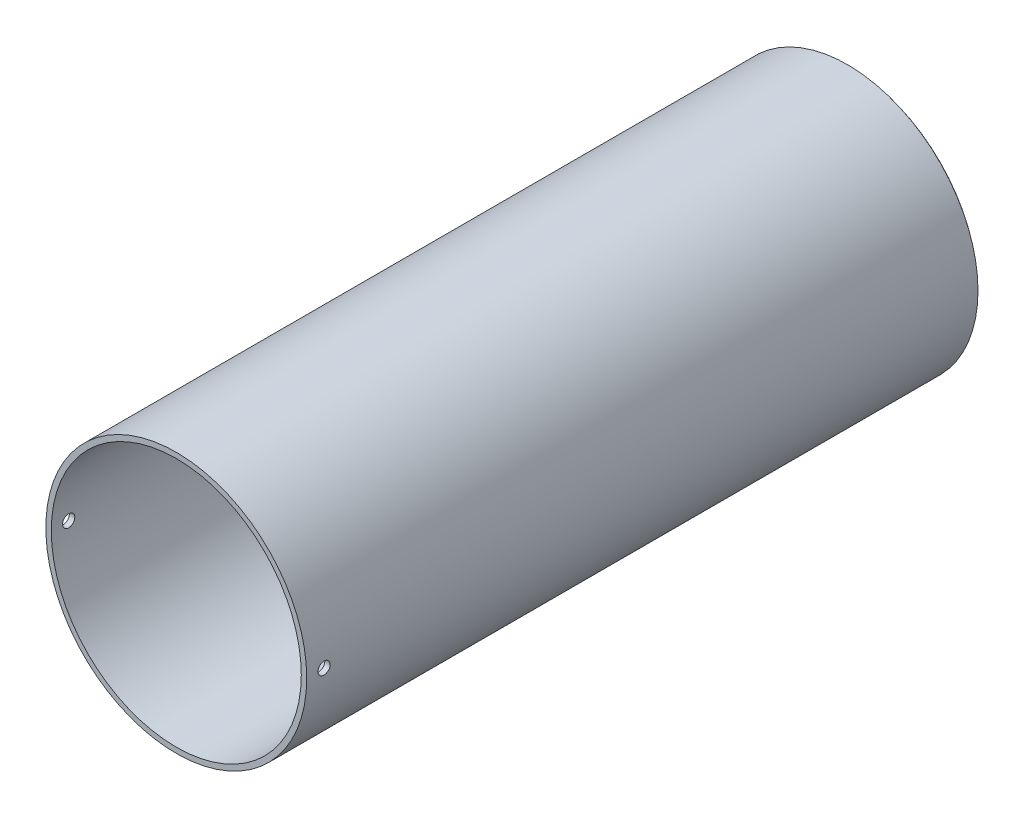
ISO-10303-21;
HEADER;
FILE_DESCRIPTION(('STEP AP214'),'2;1');
FILE_NAME('part.step','',(''),(''),'','','');
FILE_SCHEMA(('AUTOMOTIVE_DESIGN { 1 0 10303 214 1 1 1 1 }'));
ENDSEC;
DATA;
#1=APPLICATION_CONTEXT('core data for automotive mechanical design processes');
#2=APPLICATION_PROTOCOL_DEFINITION('international standard','automotive_design',2000,#1);
#3=PRODUCT_CONTEXT('',#1,'mechanical');
#4=PRODUCT('Part','Part','',(#3));
#5=PRODUCT_RELATED_PRODUCT_CATEGORY('part','',(#4));
#6=PRODUCT_DEFINITION_FORMATION('','',#4);
#7=PRODUCT_DEFINITION_CONTEXT('part definition',#1,'design');
#8=PRODUCT_DEFINITION('design','',#6,#7);
#9=PRODUCT_DEFINITION_SHAPE('','',#8);
#10=(LENGTH_UNIT() NAMED_UNIT(*) SI_UNIT(.MILLI.,.METRE.));
#11=(NAMED_UNIT(*) PLANE_ANGLE_UNIT() SI_UNIT($,.RADIAN.));
#12=(NAMED_UNIT(*) SI_UNIT($,.STERADIAN.) SOLID_ANGLE_UNIT());
#13=UNCERTAINTY_MEASURE_WITH_UNIT(LENGTH_MEASURE(1.E-05),#10,'distance_accuracy_value','');
#14=(GEOMETRIC_REPRESENTATION_CONTEXT(3) GLOBAL_UNCERTAINTY_ASSIGNED_CONTEXT((#13)) GLOBAL_UNIT_ASSIGNED_CONTEXT((#10,
#11,#12)) REPRESENTATION_CONTEXT('',''));
#15=CARTESIAN_POINT('',(0.,0.,0.));
#16=DIRECTION('',(0.,0.,1.));
#17=DIRECTION('',(1.,0.,0.));
#18=AXIS2_PLACEMENT_3D('',#15,#16,#17);
#19=CARTESIAN_POINT('',(0.,38.1,0.));
#20=DIRECTION('',(0.,0.,-1.));
#21=DIRECTION('',(-1.,0.,0.));
#22=AXIS2_PLACEMENT_3D('',#19,#20,#21);
#23=PLANE('',#22);
#24=CARTESIAN_POINT('',(0.,0.,0.));
#25=DIRECTION('',(0.,0.,1.));
#26=DIRECTION('',(1.,0.,0.));
#27=AXIS2_PLACEMENT_3D('',#24,#25,#26);
#28=CIRCLE('',#27,36.5125);
#29=CARTESIAN_POINT('',(36.5125,0.,0.));
#30=VERTEX_POINT('',#29);
#31=EDGE_CURVE('E45',#30,#30,#28,.T.);
#32=ORIENTED_EDGE('',*,*,#31,.F.);
#33=EDGE_LOOP('',(#32));
#34=FACE_BOUND('',#33,.T.);
#35=CARTESIAN_POINT('',(0.,0.,0.));
#36=DIRECTION('',(0.,0.,1.));
#37=DIRECTION('',(1.,0.,0.));
#38=AXIS2_PLACEMENT_3D('',#35,#36,#37);
#39=CIRCLE('',#38,38.1);
#40=CARTESIAN_POINT('',(38.1,0.,0.));
#41=VERTEX_POINT('',#40);
#42=EDGE_CURVE('E100',#41,#41,#39,.T.);
#43=ORIENTED_EDGE('',*,*,#42,.T.);
#44=EDGE_LOOP('',(#43));
#45=FACE_BOUND('',#44,.T.);
#46=ADVANCED_FACE('F31',(#34,#45),#23,.F.);
#47=CARTESIAN_POINT('',(0.,0.,6.98372297637004));
#48=DIRECTION('',(0.,0.,1.));
#49=DIRECTION('',(1.,0.,0.));
#50=AXIS2_PLACEMENT_3D('',#47,#48,#49);
#51=CYLINDRICAL_SURFACE('',#50,36.5125);
#52=CARTESIAN_POINT('',(36.5125,0.,-6.858));
#53=CARTESIAN_POINT('',(36.5124994204929,0.0998075755275417,-6.85799559403198));
#54=CARTESIAN_POINT('',(36.5120863777603,0.199686013452534,-6.84956776647531));
#55=CARTESIAN_POINT('',(36.5104783765829,0.396687833447208,-6.81606687988536));
#56=CARTESIAN_POINT('',(36.5092824958608,0.493807824745866,-6.79097418713155));
#57=CARTESIAN_POINT('',(36.506244178507,0.682410465229197,-6.7248634938864));
#58=CARTESIAN_POINT('',(36.5044020703647,0.773895950815854,-6.68385358328985));
#59=CARTESIAN_POINT('',(36.5002787898017,0.948659563592985,-6.58708494061618));
#60=CARTESIAN_POINT('',(36.497997721346,1.03193962713812,-6.53132969970947));
#61=CARTESIAN_POINT('',(36.4932506831572,1.18803365536662,-6.4065930189992));
#62=CARTESIAN_POINT('',(36.4907845590484,1.26083873062129,-6.33760046006383));
#63=CARTESIAN_POINT('',(36.4859466895062,1.39384040052298,-6.18836968148468));
#64=CARTESIAN_POINT('',(36.4835749479234,1.45403648117398,-6.10813100362391));
#65=CARTESIAN_POINT('',(36.4791922156014,1.56013551995046,-5.9386395573583));
#66=CARTESIAN_POINT('',(36.4771813987075,1.60603159803587,-5.84938247726926));
#67=CARTESIAN_POINT('',(36.473749133263,1.68218365209225,-5.66441827203873));
#68=CARTESIAN_POINT('',(36.4723276804101,1.71243974223388,-5.56871119398747));
#69=CARTESIAN_POINT('',(36.4702358211629,1.75642964287562,-5.37364498799));
#70=CARTESIAN_POINT('',(36.4695648142589,1.77017666464684,-5.27428884589549));
#71=CARTESIAN_POINT('',(36.4690477111512,1.78079895968665,-5.07467706476363));
#72=CARTESIAN_POINT('',(36.4692016086968,1.77767436080051,-4.97442143254795));
#73=CARTESIAN_POINT('',(36.4703164014895,1.75465312215111,-4.77594634188846));
#74=CARTESIAN_POINT('',(36.4712766099675,1.73477075563309,-4.67772522349111));
#75=CARTESIAN_POINT('',(36.4738947165247,1.67882048568433,-4.48601635762261));
#76=CARTESIAN_POINT('',(36.4755526174389,1.64275251648623,-4.39252862938649));
#77=CARTESIAN_POINT('',(36.4793800380391,1.55543857017745,-4.21289433004261));
#78=CARTESIAN_POINT('',(36.4815497770896,1.50418608284578,-4.12675092818847));
#79=CARTESIAN_POINT('',(36.4861560956191,1.38796271751476,-3.96428524501922));
#80=CARTESIAN_POINT('',(36.488592676879,1.32299174796311,-3.8879630292527));
#81=CARTESIAN_POINT('',(36.4934611022246,1.18109514436053,-3.74722314666209));
#82=CARTESIAN_POINT('',(36.4958929387495,1.10415714919051,-3.68281794162951));
#83=CARTESIAN_POINT('',(36.5004753379291,0.940553935629254,-3.5678363278642));
#84=CARTESIAN_POINT('',(36.502625900517,0.853888714923909,-3.51725992242135));
#85=CARTESIAN_POINT('',(36.5064034644708,0.673283895429682,-3.43137279584515));
#86=CARTESIAN_POINT('',(36.5080304510401,0.579344091146639,-3.39606250613828));
#87=CARTESIAN_POINT('',(36.5105772786519,0.386859934209003,-3.34171807053585));
#88=CARTESIAN_POINT('',(36.511497124717,0.288315614264195,-3.32268380903637));
#89=CARTESIAN_POINT('',(36.5125253560472,0.0895279302591268,-3.30144709464865));
#90=CARTESIAN_POINT('',(36.5126345723292,-0.0107135881936944,-3.29922740426001));
#91=CARTESIAN_POINT('',(36.5120314410053,-0.210145283020526,-3.31163786189199));
#92=CARTESIAN_POINT('',(36.5113190959743,-0.309335462688528,-3.32626795710411));
#93=CARTESIAN_POINT('',(36.509153614194,-0.503800553244399,-3.37194842433014));
#94=CARTESIAN_POINT('',(36.5077008323773,-0.599077316426904,-3.4029909292269));
#95=CARTESIAN_POINT('',(36.5042180518423,-0.783068061777955,-3.48060705735831));
#96=CARTESIAN_POINT('',(36.502188049974,-0.871782008128488,-3.52718076535027));
#97=CARTESIAN_POINT('',(36.4977771496633,-1.04020802168268,-3.63458139676938));
#98=CARTESIAN_POINT('',(36.4953959672437,-1.11991271066806,-3.69541987890972));
#99=CARTESIAN_POINT('',(36.4905518354668,-1.26798350707942,-3.82960618321753));
#100=CARTESIAN_POINT('',(36.4880888856105,-1.33634954529901,-3.90295408173173));
#101=CARTESIAN_POINT('',(36.4833564549908,-1.45986037637145,-4.06015127336657));
#102=CARTESIAN_POINT('',(36.4810871384208,-1.51499401907747,-4.14400933283956));
#103=CARTESIAN_POINT('',(36.477000450693,-1.61039881235245,-4.31980210180358));
#104=CARTESIAN_POINT('',(36.4751830776439,-1.65067002511362,-4.41173677749581));
#105=CARTESIAN_POINT('',(36.4722063827934,-1.71518735463855,-4.60103172834416));
#106=CARTESIAN_POINT('',(36.4710467687892,-1.7394405880138,-4.69838957317012));
#107=CARTESIAN_POINT('',(36.4695155338177,-1.77125677797921,-4.89580126782727));
#108=CARTESIAN_POINT('',(36.4691439086818,-1.77881982286148,-4.99585510339367));
#109=CARTESIAN_POINT('',(36.4692306632446,-1.77704010211917,-5.19570760386916));
#110=CARTESIAN_POINT('',(36.4696881816646,-1.76771487930907,-5.29550642585065));
#111=CARTESIAN_POINT('',(36.4713798372658,-1.73245958365936,-5.49211983936117));
#112=CARTESIAN_POINT('',(36.4726139759328,-1.70652947905125,-5.58893442518039));
#113=CARTESIAN_POINT('',(36.4757195814599,-1.63880401691813,-5.77683495606477));
#114=CARTESIAN_POINT('',(36.4775910536568,-1.59700852654043,-5.86792085315189));
#115=CARTESIAN_POINT('',(36.481760332638,-1.49874183620761,-6.04178360519469));
#116=CARTESIAN_POINT('',(36.4840581261533,-1.44227109298709,-6.12456071863165));
#117=CARTESIAN_POINT('',(36.4888237755972,-1.31619441083974,-6.27954357344373));
#118=CARTESIAN_POINT('',(36.4912917875911,-1.24657631330445,-6.35173941866589));
#119=CARTESIAN_POINT('',(36.4961186427336,-1.09618779551085,-6.48344138462054));
#120=CARTESIAN_POINT('',(36.4984774588621,-1.01541463446817,-6.54294437756521));
#121=CARTESIAN_POINT('',(36.5028216786487,-0.844948027233088,-6.64759794745926));
#122=CARTESIAN_POINT('',(36.5048067318859,-0.75524632933143,-6.69273508280503));
#123=CARTESIAN_POINT('',(36.5081744378893,-0.569595468228547,-6.76725434915147));
#124=CARTESIAN_POINT('',(36.509557802368,-0.473653841316839,-6.79665510360328));
#125=CARTESIAN_POINT('',(36.5112000481983,-0.314262760758964,-6.83114872779784));
#126=CARTESIAN_POINT('',(36.5116853899507,-0.251845892876802,-6.84120511453168));
#127=CARTESIAN_POINT('',(36.512335549089,-0.126295475998619,-6.85463214206612));
#128=CARTESIAN_POINT('',(36.5125003667335,-0.0631619275807328,-6.85800278825964));
#129=CARTESIAN_POINT('',(36.5125,0.,-6.858));
#130=B_SPLINE_CURVE_WITH_KNOTS('',3,(#52,#53,#54,#55,#56,#57,#58,#59,#60,#61,#62,#63,#64,#65,
#66,#67,#68,#69,#70,#71,#72,#73,#74,#75,#76,#77,#78,#79,#80,#81,#82,#83,#84,#85,#86,#87,#88,#89,
#90,#91,#92,#93,#94,#95,#96,#97,#98,#99,#100,#101,#102,#103,#104,#105,#106,#107,#108,#109,#110,
#111,#112,#113,#114,#115,#116,#117,#118,#119,#120,#121,#122,#123,#124,#125,#126,#127,#128,#129),
.UNSPECIFIED.,.T.,.F.,(4,2,2,2,2,2,2,2,2,2,2,2,2,2,2,2,2,2,2,2,2,2,2,2,2,2,2,2,2,2,2,2,2,2,2,2,
2,2,4),(0.,0.299192163231982,0.598737446682097,0.898130685767931,1.19745310253284,
1.49702805479517,1.79661521662562,2.09634629452754,2.39607518438599,2.69556405804134,
2.99505066231302,3.29428243962105,3.59351543281612,3.8928769054922,4.19224037606398,
4.49191514768168,4.79158999059194,5.09127330187835,5.39095448458327,5.69032840673037,
5.98970139061961,6.2889310031247,6.58816224862056,6.88763680358161,7.18711318634338,
7.48684104082691,7.78656764107732,8.08616098636413,8.38575274677996,8.68503348249017,
8.98431479078668,9.28359860524393,9.58287310627348,9.88242574237025,10.1820521095302,
10.4819580074323,10.7815081880818,10.9708482145295,11.1601880882505),.UNSPECIFIED.);
#131=CARTESIAN_POINT('',(36.5125,0.,-6.858));
#132=VERTEX_POINT('',#131);
#133=EDGE_CURVE('E71',#132,#132,#130,.T.);
#134=ORIENTED_EDGE('',*,*,#133,.T.);
#135=EDGE_LOOP('',(#134));
#136=FACE_BOUND('',#135,.T.);
#137=CARTESIAN_POINT('',(-36.5125,0.,-6.858));
#138=CARTESIAN_POINT('',(-36.512499420493,-0.0998075755275418,-6.85799559403197));
#139=CARTESIAN_POINT('',(-36.5120863777603,-0.199686013452534,-6.84956776647531));
#140=CARTESIAN_POINT('',(-36.5104783765829,-0.396687833447208,-6.81606687988536));
#141=CARTESIAN_POINT('',(-36.5092824958608,-0.493807824745866,-6.79097418713155));
#142=CARTESIAN_POINT('',(-36.506244178507,-0.682410465229196,-6.7248634938864));
#143=CARTESIAN_POINT('',(-36.5044020703647,-0.773895950815854,-6.68385358328985));
#144=CARTESIAN_POINT('',(-36.5002787898017,-0.948659563592984,-6.58708494061618));
#145=CARTESIAN_POINT('',(-36.497997721346,-1.03193962713812,-6.53132969970947));
#146=CARTESIAN_POINT('',(-36.4932506831572,-1.18803365536662,-6.4065930189992));
#147=CARTESIAN_POINT('',(-36.4907845590484,-1.26083873062129,-6.33760046006383));
#148=CARTESIAN_POINT('',(-36.4859466895062,-1.39384040052298,-6.18836968148468));
#149=CARTESIAN_POINT('',(-36.4835749479234,-1.45403648117398,-6.10813100362391));
#150=CARTESIAN_POINT('',(-36.4791922156014,-1.56013551995046,-5.9386395573583));
#151=CARTESIAN_POINT('',(-36.4771813987075,-1.60603159803587,-5.84938247726926));
#152=CARTESIAN_POINT('',(-36.473749133263,-1.68218365209225,-5.66441827203873));
#153=CARTESIAN_POINT('',(-36.4723276804101,-1.71243974223388,-5.56871119398747));
#154=CARTESIAN_POINT('',(-36.4702358211629,-1.75642964287562,-5.37364498799));
#155=CARTESIAN_POINT('',(-36.4695648142589,-1.77017666464684,-5.27428884589549));
#156=CARTESIAN_POINT('',(-36.4690477111512,-1.78079895968665,-5.07467706476363));
#157=CARTESIAN_POINT('',(-36.4692016086968,-1.77767436080051,-4.97442143254795));
#158=CARTESIAN_POINT('',(-36.4703164014895,-1.75465312215111,-4.77594634188847));
#159=CARTESIAN_POINT('',(-36.4712766099675,-1.73477075563309,-4.67772522349111));
#160=CARTESIAN_POINT('',(-36.4738947165247,-1.67882048568433,-4.48601635762261));
#161=CARTESIAN_POINT('',(-36.4755526174389,-1.64275251648623,-4.39252862938649));
#162=CARTESIAN_POINT('',(-36.4793800380391,-1.55543857017745,-4.21289433004261));
#163=CARTESIAN_POINT('',(-36.4815497770896,-1.50418608284578,-4.12675092818847));
#164=CARTESIAN_POINT('',(-36.4861560956191,-1.38796271751476,-3.96428524501922));
#165=CARTESIAN_POINT('',(-36.488592676879,-1.32299174796311,-3.8879630292527));
#166=CARTESIAN_POINT('',(-36.4934611022246,-1.18109514436053,-3.74722314666209));
#167=CARTESIAN_POINT('',(-36.4958929387495,-1.10415714919051,-3.68281794162951));
#168=CARTESIAN_POINT('',(-36.5004753379291,-0.940553935629253,-3.5678363278642));
#169=CARTESIAN_POINT('',(-36.502625900517,-0.853888714923908,-3.51725992242135));
#170=CARTESIAN_POINT('',(-36.5064034644708,-0.673283895429682,-3.43137279584515));
#171=CARTESIAN_POINT('',(-36.5080304510401,-0.579344091146639,-3.39606250613828));
#172=CARTESIAN_POINT('',(-36.5105772786519,-0.386859934209003,-3.34171807053585));
#173=CARTESIAN_POINT('',(-36.511497124717,-0.288315614264195,-3.32268380903637));
#174=CARTESIAN_POINT('',(-36.5125253560472,-0.0895279302591271,-3.30144709464865));
#175=CARTESIAN_POINT('',(-36.5126345723292,0.010713588193694,-3.29922740426001));
#176=CARTESIAN_POINT('',(-36.5120314410053,0.210145283020526,-3.31163786189199));
#177=CARTESIAN_POINT('',(-36.5113190959743,0.309335462688528,-3.32626795710411));
#178=CARTESIAN_POINT('',(-36.509153614194,0.503800553244398,-3.37194842433014));
#179=CARTESIAN_POINT('',(-36.5077008323773,0.599077316426903,-3.4029909292269));
#180=CARTESIAN_POINT('',(-36.5042180518423,0.783068061777954,-3.48060705735831));
#181=CARTESIAN_POINT('',(-36.502188049974,0.871782008128487,-3.52718076535027));
#182=CARTESIAN_POINT('',(-36.4977771496633,1.04020802168268,-3.63458139676938));
#183=CARTESIAN_POINT('',(-36.4953959672437,1.11991271066805,-3.69541987890972));
#184=CARTESIAN_POINT('',(-36.4905518354668,1.26798350707942,-3.82960618321753));
#185=CARTESIAN_POINT('',(-36.4880888856105,1.33634954529901,-3.90295408173173));
#186=CARTESIAN_POINT('',(-36.4833564549908,1.45986037637145,-4.06015127336656));
#187=CARTESIAN_POINT('',(-36.4810871384208,1.51499401907747,-4.14400933283956));
#188=CARTESIAN_POINT('',(-36.477000450693,1.61039881235245,-4.31980210180358));
#189=CARTESIAN_POINT('',(-36.4751830776439,1.65067002511362,-4.41173677749581));
#190=CARTESIAN_POINT('',(-36.4722063827934,1.71518735463855,-4.60103172834416));
#191=CARTESIAN_POINT('',(-36.4710467687892,1.7394405880138,-4.69838957317011));
#192=CARTESIAN_POINT('',(-36.4695155338177,1.77125677797921,-4.89580126782726));
#193=CARTESIAN_POINT('',(-36.4691439086818,1.77881982286148,-4.99585510339367));
#194=CARTESIAN_POINT('',(-36.4692306632446,1.77704010211917,-5.19570760386916));
#195=CARTESIAN_POINT('',(-36.4696881816646,1.76771487930907,-5.29550642585064));
#196=CARTESIAN_POINT('',(-36.4713798372658,1.73245958365936,-5.49211983936117));
#197=CARTESIAN_POINT('',(-36.4726139759328,1.70652947905125,-5.58893442518039));
#198=CARTESIAN_POINT('',(-36.4757195814599,1.63880401691813,-5.77683495606477));
#199=CARTESIAN_POINT('',(-36.4775910536568,1.59700852654043,-5.86792085315189));
#200=CARTESIAN_POINT('',(-36.481760332638,1.49874183620761,-6.04178360519469));
#201=CARTESIAN_POINT('',(-36.4840581261533,1.44227109298709,-6.12456071863165));
#202=CARTESIAN_POINT('',(-36.4888237755972,1.31619441083975,-6.27954357344373));
#203=CARTESIAN_POINT('',(-36.4912917875911,1.24657631330445,-6.35173941866589));
#204=CARTESIAN_POINT('',(-36.4961186427336,1.09618779551085,-6.48344138462054));
#205=CARTESIAN_POINT('',(-36.4984774588621,1.01541463446817,-6.54294437756521));
#206=CARTESIAN_POINT('',(-36.5028216786487,0.844948027233088,-6.64759794745926));
#207=CARTESIAN_POINT('',(-36.5048067318859,0.755246329331431,-6.69273508280503));
#208=CARTESIAN_POINT('',(-36.5081744378893,0.569595468228547,-6.76725434915147));
#209=CARTESIAN_POINT('',(-36.509557802368,0.473653841316839,-6.79665510360328));
#210=CARTESIAN_POINT('',(-36.5112000481983,0.314262760758965,-6.83114872779784));
#211=CARTESIAN_POINT('',(-36.5116853899507,0.251845892876802,-6.84120511453168));
#212=CARTESIAN_POINT('',(-36.512335549089,0.126295475998619,-6.85463214206612));
#213=CARTESIAN_POINT('',(-36.5125003667335,0.0631619275807331,-6.85800278825963));
#214=CARTESIAN_POINT('',(-36.5125,0.,-6.858));
#215=B_SPLINE_CURVE_WITH_KNOTS('',3,(#137,#138,#139,#140,#141,#142,#143,#144,#145,#146,#147,
#148,#149,#150,#151,#152,#153,#154,#155,#156,#157,#158,#159,#160,#161,#162,#163,#164,#165,#166,
#167,#168,#169,#170,#171,#172,#173,#174,#175,#176,#177,#178,#179,#180,#181,#182,#183,#184,#185,
#186,#187,#188,#189,#190,#191,#192,#193,#194,#195,#196,#197,#198,#199,#200,#201,#202,#203,#204,
#205,#206,#207,#208,#209,#210,#211,#212,#213,#214),.UNSPECIFIED.,.T.,.F.,(4,2,2,2,2,2,2,2,2,2,2,
2,2,2,2,2,2,2,2,2,2,2,2,2,2,2,2,2,2,2,2,2,2,2,2,2,2,2,4),(0.,0.299192163231982,
0.598737446682097,0.89813068576793,1.19745310253284,1.49702805479517,1.79661521662562,
2.09634629452754,2.39607518438599,2.69556405804134,2.99505066231302,3.29428243962105,
3.59351543281611,3.8928769054922,4.19224037606398,4.49191514768168,4.79158999059194,
5.09127330187835,5.39095448458327,5.69032840673037,5.98970139061961,6.2889310031247,
6.58816224862056,6.88763680358161,7.18711318634337,7.48684104082691,7.78656764107732,
8.08616098636413,8.38575274677996,8.68503348249017,8.98431479078667,9.28359860524393,
9.58287310627348,9.88242574237025,10.1820521095302,10.4819580074323,10.7815081880819,
10.9708482145295,11.1601880882505),.UNSPECIFIED.);
#216=CARTESIAN_POINT('',(-36.5125,0.,-6.858));
#217=VERTEX_POINT('',#216);
#218=EDGE_CURVE('E67',#217,#217,#215,.T.);
#219=ORIENTED_EDGE('',*,*,#218,.T.);
#220=EDGE_LOOP('',(#219));
#221=FACE_BOUND('',#220,.T.);
#222=CARTESIAN_POINT('',(0.,0.,-196.85));
#223=DIRECTION('',(0.,0.,1.));
#224=DIRECTION('',(1.,0.,0.));
#225=AXIS2_PLACEMENT_3D('',#222,#223,#224);
#226=CIRCLE('',#225,36.5125);
#227=CARTESIAN_POINT('',(36.5125,0.,-196.85));
#228=VERTEX_POINT('',#227);
#229=EDGE_CURVE('E49',#228,#228,#226,.T.);
#230=ORIENTED_EDGE('',*,*,#229,.F.);
#231=EDGE_LOOP('',(#230));
#232=FACE_BOUND('',#231,.T.);
#233=ORIENTED_EDGE('',*,*,#31,.T.);
#234=EDGE_LOOP('',(#233));
#235=FACE_BOUND('',#234,.T.);
#236=ADVANCED_FACE('F75',(#136,#221,#232,#235),#51,.F.);
#237=CARTESIAN_POINT('',(0.,36.5125,-196.85));
#238=DIRECTION('',(0.,0.,1.));
#239=DIRECTION('',(1.,0.,0.));
#240=AXIS2_PLACEMENT_3D('',#237,#238,#239);
#241=PLANE('',#240);
#242=CARTESIAN_POINT('',(0.,0.,-196.85));
#243=DIRECTION('',(0.,0.,1.));
#244=DIRECTION('',(1.,0.,0.));
#245=AXIS2_PLACEMENT_3D('',#242,#243,#244);
#246=CIRCLE('',#245,37.084);
#247=CARTESIAN_POINT('',(37.084,0.,-196.85));
#248=VERTEX_POINT('',#247);
#249=EDGE_CURVE('E104',#248,#248,#246,.T.);
#250=ORIENTED_EDGE('',*,*,#249,.F.);
#251=EDGE_LOOP('',(#250));
#252=FACE_BOUND('',#251,.T.);
#253=ORIENTED_EDGE('',*,*,#229,.T.);
#254=EDGE_LOOP('',(#253));
#255=FACE_BOUND('',#254,.T.);
#256=ADVANCED_FACE('F79',(#252,#255),#241,.F.);
#257=CARTESIAN_POINT('',(0.,0.,-196.85));
#258=DIRECTION('',(0.,0.,1.));
#259=DIRECTION('',(1.,0.,0.));
#260=AXIS2_PLACEMENT_3D('',#257,#258,#259);
#261=CONICAL_SURFACE('',#260,37.084,0.916297857297025);
#262=CARTESIAN_POINT('',(0.,0.,-196.070395780213));
#263=DIRECTION('',(0.,0.,1.));
#264=DIRECTION('',(1.,0.,0.));
#265=AXIS2_PLACEMENT_3D('',#262,#263,#264);
#266=CIRCLE('',#265,38.1);
#267=CARTESIAN_POINT('',(38.1,0.,-196.070395780213));
#268=VERTEX_POINT('',#267);
#269=EDGE_CURVE('E102',#268,#268,#266,.T.);
#270=ORIENTED_EDGE('',*,*,#269,.F.);
#271=EDGE_LOOP('',(#270));
#272=FACE_BOUND('',#271,.T.);
#273=ORIENTED_EDGE('',*,*,#249,.T.);
#274=EDGE_LOOP('',(#273));
#275=FACE_BOUND('',#274,.T.);
#276=ADVANCED_FACE('F83',(#272,#275),#261,.T.);
#277=CARTESIAN_POINT('',(0.,0.,6.98372297637004));
#278=DIRECTION('',(0.,0.,1.));
#279=DIRECTION('',(1.,0.,0.));
#280=AXIS2_PLACEMENT_3D('',#277,#278,#279);
#281=CYLINDRICAL_SURFACE('',#280,38.1);
#282=CARTESIAN_POINT('',(-38.1,0.,-6.858));
#283=CARTESIAN_POINT('',(-38.0999994441626,0.099812749705971,-6.8579955920693));
#284=CARTESIAN_POINT('',(-38.0996035700821,0.199696488633295,-6.84956689417117));
#285=CARTESIAN_POINT('',(-38.0980624074167,0.396709119321493,-6.81606234890933));
#286=CARTESIAN_POINT('',(-38.0969162334145,0.493834614653942,-6.79096683278246));
#287=CARTESIAN_POINT('',(-38.0940042133738,0.682448290159791,-6.72484820008546));
#288=CARTESIAN_POINT('',(-38.0922386806371,0.773939293077813,-6.68383313528286));
#289=CARTESIAN_POINT('',(-38.0882868464822,0.948712850242141,-6.58705188233875));
#290=CARTESIAN_POINT('',(-38.0861006451061,1.03199734902628,-6.53128920024976));
#291=CARTESIAN_POINT('',(-38.0815512575883,1.18809356149998,-6.40653951193624));
#292=CARTESIAN_POINT('',(-38.0791879341195,1.26089701854364,-6.33754217857001));
#293=CARTESIAN_POINT('',(-38.0745518511581,1.39389425938046,-6.1883021254132));
#294=CARTESIAN_POINT('',(-38.0722790953491,1.45408753071392,-6.10805894882889));
#295=CARTESIAN_POINT('',(-38.0680794957026,1.56017749349482,-5.93856299677354));
#296=CARTESIAN_POINT('',(-38.0661528043202,1.60606789047024,-5.84930627739617));
#297=CARTESIAN_POINT('',(-38.0628642325493,1.68220901568922,-5.66434470731891));
#298=CARTESIAN_POINT('',(-38.0615023482826,1.71245985131671,-5.5686399008978));
#299=CARTESIAN_POINT('',(-38.0594981818559,1.75644174475752,-5.37357344734878));
#300=CARTESIAN_POINT('',(-38.0588553712412,1.77018493476086,-5.27421454119815));
#301=CARTESIAN_POINT('',(-38.0583602519083,1.7807988437729,-5.07459807647242));
#302=CARTESIAN_POINT('',(-38.0585079375731,1.77766968266979,-4.97434052428779));
#303=CARTESIAN_POINT('',(-38.0595766652147,1.75463783614635,-4.77585513404908));
#304=CARTESIAN_POINT('',(-38.0604971029412,1.73474825642347,-4.67762577153215));
#305=CARTESIAN_POINT('',(-38.0630066370585,1.67878046915408,-4.48590162991956));
#306=CARTESIAN_POINT('',(-38.0645957360032,1.6427021997794,-4.39240686890791));
#307=CARTESIAN_POINT('',(-38.0682641777502,1.55536617746858,-4.21276366904884));
#308=CARTESIAN_POINT('',(-38.0703437136753,1.50410244280331,-4.12661814240488));
#309=CARTESIAN_POINT('',(-38.0747584393152,1.38785504655009,-3.96415062842462));
#310=CARTESIAN_POINT('',(-38.0770936305887,1.3228713013111,-3.88782870098748));
#311=CARTESIAN_POINT('',(-38.0817591452121,1.18095454234457,-3.74709859637983));
#312=CARTESIAN_POINT('',(-38.0840894617842,1.10401017741824,-3.68270186534097));
#313=CARTESIAN_POINT('',(-38.088480419358,0.940396266369328,-3.56773832386292));
#314=CARTESIAN_POINT('',(-38.0905410602989,0.853726718046912,-3.51717151655206));
#315=CARTESIAN_POINT('',(-38.0941604958614,0.673116036890435,-3.43130435903327));
#316=CARTESIAN_POINT('',(-38.0957192776119,0.579174717632103,-3.39600440037001));
#317=CARTESIAN_POINT('',(-38.0981591193834,0.386690089224036,-3.34168042202306));
#318=CARTESIAN_POINT('',(-38.0990401838275,0.288146810112509,-3.32265629611836));
#319=CARTESIAN_POINT('',(-38.1000247215275,0.0893549286928191,-3.30143809909175));
#320=CARTESIAN_POINT('',(-38.1001289263276,-0.0108919801592819,-3.29922819451116));
#321=CARTESIAN_POINT('',(-38.0995499416424,-0.21033283378834,-3.31165986280598));
#322=CARTESIAN_POINT('',(-38.0988667544199,-0.30952678159049,-3.32630138725342));
#323=CARTESIAN_POINT('',(-38.0967904151398,-0.504001641924741,-3.37200719005056));
#324=CARTESIAN_POINT('',(-38.0953975752808,-0.599284255275615,-3.40306424691214));
#325=CARTESIAN_POINT('',(-38.0920587727529,-0.783284086181714,-3.48071219826117));
#326=CARTESIAN_POINT('',(-38.0901128073146,-0.872001270861628,-3.52730317052572));
#327=CARTESIAN_POINT('',(-38.0858849031983,-1.04042463048986,-3.63473699361767));
#328=CARTESIAN_POINT('',(-38.0836027145791,-1.12012402319646,-3.6955904669461));
#329=CARTESIAN_POINT('',(-38.0789602539419,-1.26818124891685,-3.82980635094148));
#330=CARTESIAN_POINT('',(-38.076599981484,-1.3365390180238,-3.90316883208845));
#331=CARTESIAN_POINT('',(-38.0720653073109,-1.46002579536328,-4.06038830494075));
#332=CARTESIAN_POINT('',(-38.0698910502801,-1.51514456533936,-4.1442533429394));
#333=CARTESIAN_POINT('',(-38.0659758510027,-1.61051875653525,-4.32005659154494));
#334=CARTESIAN_POINT('',(-38.0642349070522,-1.65077423620081,-4.4119947704047));
#335=CARTESIAN_POINT('',(-38.0613836782557,-1.71526126543727,-4.601296459495));
#336=CARTESIAN_POINT('',(-38.0602731357968,-1.7394993611645,-4.69865773569407));
#337=CARTESIAN_POINT('',(-38.0588072127904,-1.77128501007475,-4.89607321450444));
#338=CARTESIAN_POINT('',(-38.0584518286875,-1.77883264184133,-4.99612740443446));
#339=CARTESIAN_POINT('',(-38.0585363887879,-1.77702234695512,-5.19598657332258));
#340=CARTESIAN_POINT('',(-38.058975575064,-1.7676805308663,-5.29579169893085));
#341=CARTESIAN_POINT('',(-38.0605981738535,-1.73238979649967,-5.49241503733707));
#342=CARTESIAN_POINT('',(-38.0617815877987,-1.70644084627188,-5.5892332443882));
#343=CARTESIAN_POINT('',(-38.0647590917723,-1.63867561828834,-5.77713810744827));
#344=CARTESIAN_POINT('',(-38.0665531878077,-1.59685918445162,-5.86822470706781));
#345=CARTESIAN_POINT('',(-38.0705497783215,-1.49854901841658,-6.04208499627897));
#346=CARTESIAN_POINT('',(-38.0727522598193,-1.4420557527016,-6.12485894996094));
#347=CARTESIAN_POINT('',(-38.0773197466704,-1.31593869804536,-6.27982423873161));
#348=CARTESIAN_POINT('',(-38.0796848877922,-1.24630385345847,-6.35200657183645));
#349=CARTESIAN_POINT('',(-38.0843102455238,-1.09588429578184,-6.48367851303091));
#350=CARTESIAN_POINT('',(-38.0865704361442,-1.01509684039659,-6.54316499017175));
#351=CARTESIAN_POINT('',(-38.0907325911875,-0.84460837262856,-6.64778082532395));
#352=CARTESIAN_POINT('',(-38.0926342331504,-0.754899446428707,-6.69289728458513));
#353=CARTESIAN_POINT('',(-38.0958600297057,-0.569238781007752,-6.76737452153843));
#354=CARTESIAN_POINT('',(-38.097184867368,-0.473294581463816,-6.7967539450766));
#355=CARTESIAN_POINT('',(-38.0987566163946,-0.313960199942343,-6.83120079287984));
#356=CARTESIAN_POINT('',(-38.0992208413613,-0.251602509841593,-6.84123770260242));
#357=CARTESIAN_POINT('',(-38.0998427087481,-0.126172670062449,-6.8546386970259));
#358=CARTESIAN_POINT('',(-38.1000003513943,-0.0631005209107072,-6.85800278664524));
#359=CARTESIAN_POINT('',(-38.1,0.,-6.858));
#360=B_SPLINE_CURVE_WITH_KNOTS('',3,(#282,#283,#284,#285,#286,#287,#288,#289,#290,#291,#292,
#293,#294,#295,#296,#297,#298,#299,#300,#301,#302,#303,#304,#305,#306,#307,#308,#309,#310,#311,
#312,#313,#314,#315,#316,#317,#318,#319,#320,#321,#322,#323,#324,#325,#326,#327,#328,#329,#330,
#331,#332,#333,#334,#335,#336,#337,#338,#339,#340,#341,#342,#343,#344,#345,#346,#347,#348,#349,
#350,#351,#352,#353,#354,#355,#356,#357,#358,#359),.UNSPECIFIED.,.T.,.F.,(4,2,2,2,2,2,2,2,2,2,2,
2,2,2,2,2,2,2,2,2,2,2,2,2,2,2,2,2,2,2,2,2,2,2,2,2,2,2,4),(0.,0.299207911802189,
0.598769552290252,0.89817987792177,1.19751908656271,1.49709283009209,1.79667874550469,
2.09639631845101,2.39611183345751,2.69560693939394,2.99509991724043,3.29435892562804,
3.59361907696143,3.8929972674183,4.19237728323954,4.49204317948553,4.79170914351585,
5.09138279254103,5.39105448579052,5.69044395203593,5.98983255789223,6.28908956679763,
6.58834807408228,6.88783017697323,7.18731396730423,7.48702862026928,7.78674209467751,
8.08633300308866,8.3859225009357,8.68522637609414,8.98453082707588,9.28383822225079,
9.58313610550644,9.88268691134155,10.1823115048188,10.4822042929338,10.7817409661158,
10.9708970515584,11.1600529975768),.UNSPECIFIED.);
#361=CARTESIAN_POINT('',(-38.1,0.,-6.858));
#362=VERTEX_POINT('',#361);
#363=EDGE_CURVE('E10',#362,#362,#360,.T.);
#364=ORIENTED_EDGE('',*,*,#363,.T.);
#365=EDGE_LOOP('',(#364));
#366=FACE_BOUND('',#365,.T.);
#367=CARTESIAN_POINT('',(38.1,0.,-6.858));
#368=CARTESIAN_POINT('',(38.0999994441626,-0.0998127497059708,-6.8579955920693));
#369=CARTESIAN_POINT('',(38.0996035700821,-0.199696488633295,-6.84956689417117));
#370=CARTESIAN_POINT('',(38.0980624074167,-0.396709119321493,-6.81606234890933));
#371=CARTESIAN_POINT('',(38.0969162334145,-0.493834614653942,-6.79096683278246));
#372=CARTESIAN_POINT('',(38.0940042133738,-0.682448290159792,-6.72484820008546));
#373=CARTESIAN_POINT('',(38.0922386806371,-0.773939293077814,-6.68383313528286));
#374=CARTESIAN_POINT('',(38.0882868464822,-0.948712850242142,-6.58705188233875));
#375=CARTESIAN_POINT('',(38.0861006451061,-1.03199734902628,-6.53128920024976));
#376=CARTESIAN_POINT('',(38.0815512575883,-1.18809356149998,-6.40653951193624));
#377=CARTESIAN_POINT('',(38.0791879341195,-1.26089701854364,-6.33754217857001));
#378=CARTESIAN_POINT('',(38.0745518511581,-1.39389425938046,-6.1883021254132));
#379=CARTESIAN_POINT('',(38.0722790953491,-1.45408753071392,-6.10805894882889));
#380=CARTESIAN_POINT('',(38.0680794957026,-1.56017749349482,-5.93856299677354));
#381=CARTESIAN_POINT('',(38.0661528043202,-1.60606789047024,-5.84930627739617));
#382=CARTESIAN_POINT('',(38.0628642325493,-1.68220901568922,-5.66434470731891));
#383=CARTESIAN_POINT('',(38.0615023482826,-1.71245985131671,-5.5686399008978));
#384=CARTESIAN_POINT('',(38.0594981818559,-1.75644174475752,-5.37357344734878));
#385=CARTESIAN_POINT('',(38.0588553712412,-1.77018493476086,-5.27421454119815));
#386=CARTESIAN_POINT('',(38.0583602519083,-1.7807988437729,-5.07459807647242));
#387=CARTESIAN_POINT('',(38.0585079375731,-1.77766968266979,-4.97434052428779));
#388=CARTESIAN_POINT('',(38.0595766652147,-1.75463783614635,-4.77585513404908));
#389=CARTESIAN_POINT('',(38.0604971029412,-1.73474825642347,-4.67762577153215));
#390=CARTESIAN_POINT('',(38.0630066370585,-1.67878046915408,-4.48590162991956));
#391=CARTESIAN_POINT('',(38.0645957360032,-1.6427021997794,-4.39240686890791));
#392=CARTESIAN_POINT('',(38.0682641777502,-1.55536617746858,-4.21276366904884));
#393=CARTESIAN_POINT('',(38.0703437136753,-1.50410244280331,-4.12661814240488));
#394=CARTESIAN_POINT('',(38.0747584393152,-1.38785504655009,-3.96415062842463));
#395=CARTESIAN_POINT('',(38.0770936305887,-1.3228713013111,-3.88782870098748));
#396=CARTESIAN_POINT('',(38.0817591452121,-1.18095454234457,-3.74709859637983));
#397=CARTESIAN_POINT('',(38.0840894617842,-1.10401017741824,-3.68270186534097));
#398=CARTESIAN_POINT('',(38.088480419358,-0.940396266369329,-3.56773832386292));
#399=CARTESIAN_POINT('',(38.0905410602989,-0.853726718046914,-3.51717151655206));
#400=CARTESIAN_POINT('',(38.0941604958614,-0.673116036890436,-3.43130435903327));
#401=CARTESIAN_POINT('',(38.0957192776119,-0.579174717632104,-3.39600440037002));
#402=CARTESIAN_POINT('',(38.0981591193834,-0.386690089224038,-3.34168042202306));
#403=CARTESIAN_POINT('',(38.0990401838275,-0.28814681011251,-3.32265629611837));
#404=CARTESIAN_POINT('',(38.1000247215275,-0.0893549286928202,-3.30143809909175));
#405=CARTESIAN_POINT('',(38.1001289263276,0.0108919801592808,-3.29922819451116));
#406=CARTESIAN_POINT('',(38.0995499416424,0.210332833788339,-3.31165986280598));
#407=CARTESIAN_POINT('',(38.0988667544199,0.309526781590489,-3.32630138725342));
#408=CARTESIAN_POINT('',(38.0967904151398,0.504001641924741,-3.37200719005056));
#409=CARTESIAN_POINT('',(38.0953975752808,0.599284255275614,-3.40306424691214));
#410=CARTESIAN_POINT('',(38.0920587727529,0.783284086181714,-3.48071219826117));
#411=CARTESIAN_POINT('',(38.0901128073146,0.872001270861628,-3.52730317052572));
#412=CARTESIAN_POINT('',(38.0858849031983,1.04042463048986,-3.63473699361767));
#413=CARTESIAN_POINT('',(38.0836027145791,1.12012402319646,-3.6955904669461));
#414=CARTESIAN_POINT('',(38.0789602539419,1.26818124891685,-3.82980635094148));
#415=CARTESIAN_POINT('',(38.076599981484,1.3365390180238,-3.90316883208845));
#416=CARTESIAN_POINT('',(38.0720653073109,1.46002579536328,-4.06038830494075));
#417=CARTESIAN_POINT('',(38.0698910502801,1.51514456533936,-4.1442533429394));
#418=CARTESIAN_POINT('',(38.0659758510027,1.61051875653525,-4.32005659154494));
#419=CARTESIAN_POINT('',(38.0642349070522,1.65077423620081,-4.4119947704047));
#420=CARTESIAN_POINT('',(38.0613836782557,1.71526126543727,-4.601296459495));
#421=CARTESIAN_POINT('',(38.0602731357968,1.7394993611645,-4.69865773569408));
#422=CARTESIAN_POINT('',(38.0588072127904,1.77128501007475,-4.89607321450444));
#423=CARTESIAN_POINT('',(38.0584518286875,1.77883264184133,-4.99612740443446));
#424=CARTESIAN_POINT('',(38.0585363887879,1.77702234695512,-5.19598657332258));
#425=CARTESIAN_POINT('',(38.058975575064,1.7676805308663,-5.29579169893085));
#426=CARTESIAN_POINT('',(38.0605981738535,1.73238979649967,-5.49241503733707));
#427=CARTESIAN_POINT('',(38.0617815877987,1.70644084627188,-5.5892332443882));
#428=CARTESIAN_POINT('',(38.0647590917723,1.63867561828834,-5.77713810744827));
#429=CARTESIAN_POINT('',(38.0665531878077,1.59685918445162,-5.86822470706781));
#430=CARTESIAN_POINT('',(38.0705497783215,1.49854901841658,-6.04208499627897));
#431=CARTESIAN_POINT('',(38.0727522598193,1.4420557527016,-6.12485894996094));
#432=CARTESIAN_POINT('',(38.0773197466704,1.31593869804536,-6.27982423873161));
#433=CARTESIAN_POINT('',(38.0796848877922,1.24630385345847,-6.35200657183645));
#434=CARTESIAN_POINT('',(38.0843102455238,1.09588429578184,-6.48367851303091));
#435=CARTESIAN_POINT('',(38.0865704361442,1.01509684039659,-6.54316499017174));
#436=CARTESIAN_POINT('',(38.0907325911875,0.844608372628561,-6.64778082532395));
#437=CARTESIAN_POINT('',(38.0926342331504,0.754899446428709,-6.69289728458513));
#438=CARTESIAN_POINT('',(38.0958600297057,0.569238781007753,-6.76737452153843));
#439=CARTESIAN_POINT('',(38.097184867368,0.473294581463817,-6.7967539450766));
#440=CARTESIAN_POINT('',(38.0987566163946,0.313960199942344,-6.83120079287984));
#441=CARTESIAN_POINT('',(38.0992208413613,0.251602509841592,-6.84123770260242));
#442=CARTESIAN_POINT('',(38.0998427087481,0.126172670062448,-6.8546386970259));
#443=CARTESIAN_POINT('',(38.1000003513943,0.0631005209107069,-6.85800278664524));
#444=CARTESIAN_POINT('',(38.1,0.,-6.858));
#445=B_SPLINE_CURVE_WITH_KNOTS('',3,(#367,#368,#369,#370,#371,#372,#373,#374,#375,#376,#377,
#378,#379,#380,#381,#382,#383,#384,#385,#386,#387,#388,#389,#390,#391,#392,#393,#394,#395,#396,
#397,#398,#399,#400,#401,#402,#403,#404,#405,#406,#407,#408,#409,#410,#411,#412,#413,#414,#415,
#416,#417,#418,#419,#420,#421,#422,#423,#424,#425,#426,#427,#428,#429,#430,#431,#432,#433,#434,
#435,#436,#437,#438,#439,#440,#441,#442,#443,#444),.UNSPECIFIED.,.T.,.F.,(4,2,2,2,2,2,2,2,2,2,2,
2,2,2,2,2,2,2,2,2,2,2,2,2,2,2,2,2,2,2,2,2,2,2,2,2,2,2,4),(0.,0.299207911802189,
0.598769552290253,0.89817987792177,1.19751908656271,1.49709283009209,1.79667874550469,
2.09639631845101,2.39611183345751,2.69560693939394,2.99509991724043,3.29435892562804,
3.59361907696143,3.8929972674183,4.19237728323954,4.49204317948553,4.79170914351585,
5.09138279254102,5.39105448579052,5.69044395203593,5.98983255789222,6.28908956679763,
6.58834807408228,6.88783017697323,7.18731396730423,7.48702862026928,7.78674209467751,
8.08633300308866,8.3859225009357,8.68522637609414,8.98453082707588,9.28383822225079,
9.58313610550644,9.88268691134155,10.1823115048188,10.4822042929338,10.7817409661158,
10.9708970515584,11.1600529975768),.UNSPECIFIED.);
#446=CARTESIAN_POINT('',(38.1,0.,-6.858));
#447=VERTEX_POINT('',#446);
#448=EDGE_CURVE('E41',#447,#447,#445,.T.);
#449=ORIENTED_EDGE('',*,*,#448,.T.);
#450=EDGE_LOOP('',(#449));
#451=FACE_BOUND('',#450,.T.);
#452=ORIENTED_EDGE('',*,*,#42,.F.);
#453=EDGE_LOOP('',(#452));
#454=FACE_BOUND('',#453,.T.);
#455=ORIENTED_EDGE('',*,*,#269,.T.);
#456=EDGE_LOOP('',(#455));
#457=FACE_BOUND('',#456,.T.);
#458=ADVANCED_FACE('F54',(#366,#451,#454,#457),#281,.T.);
#459=CARTESIAN_POINT('',(-38.1,0.,-5.08));
#460=DIRECTION('',(1.,0.,0.));
#461=DIRECTION('',(0.,0.,-1.));
#462=AXIS2_PLACEMENT_3D('',#459,#460,#461);
#463=CYLINDRICAL_SURFACE('',#462,1.778);
#464=ORIENTED_EDGE('',*,*,#363,.F.);
#465=EDGE_LOOP('',(#464));
#466=FACE_BOUND('',#465,.T.);
#467=ORIENTED_EDGE('',*,*,#218,.F.);
#468=EDGE_LOOP('',(#467));
#469=FACE_BOUND('',#468,.T.);
#470=ADVANCED_FACE('F60',(#466,#469),#463,.F.);
#471=ORIENTED_EDGE('',*,*,#448,.F.);
#472=EDGE_LOOP('',(#471));
#473=FACE_BOUND('',#472,.T.);
#474=ORIENTED_EDGE('',*,*,#133,.F.);
#475=EDGE_LOOP('',(#474));
#476=FACE_BOUND('',#475,.T.);
#477=ADVANCED_FACE('F57',(#473,#476),#463,.F.);
#478=CLOSED_SHELL('',(#46,#236,#256,#276,#458,#470,#477));
#479=MANIFOLD_SOLID_BREP('B2',#478);
#480=ADVANCED_BREP_SHAPE_REPRESENTATION('',(#18,#479),#14);
#481=SHAPE_DEFINITION_REPRESENTATION(#9,#480);
ENDSEC;
END-ISO-10303-21;
